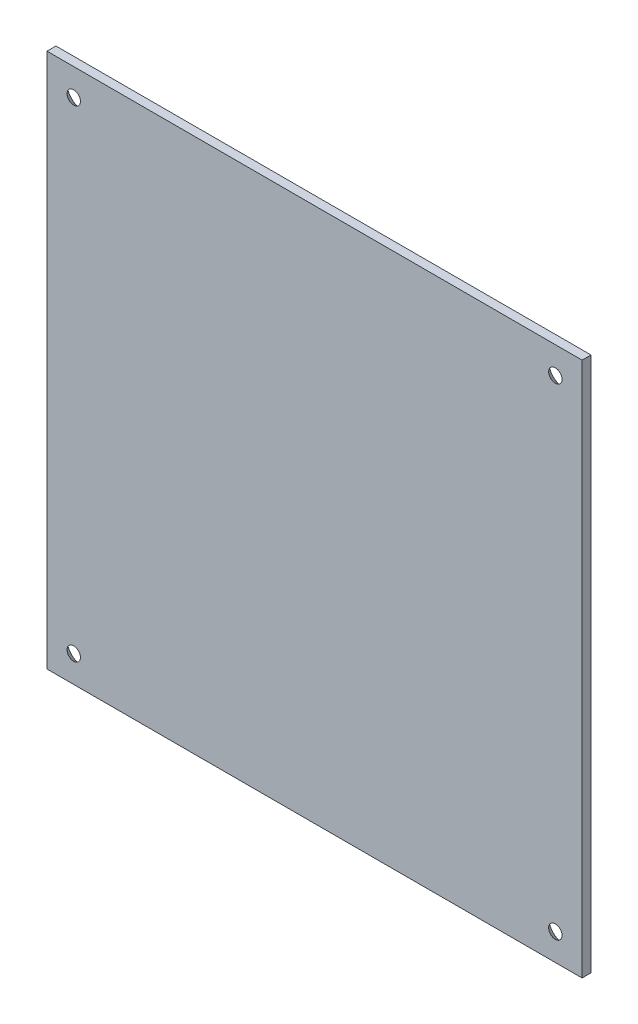
ISO-10303-21;
HEADER;
FILE_DESCRIPTION(('STEP AP214'),'2;1');
FILE_NAME('part.step','',(''),(''),'','','');
FILE_SCHEMA(('AUTOMOTIVE_DESIGN { 1 0 10303 214 1 1 1 1 }'));
ENDSEC;
DATA;
#1=APPLICATION_CONTEXT('core data for automotive mechanical design processes');
#2=APPLICATION_PROTOCOL_DEFINITION('international standard','automotive_design',2000,#1);
#3=PRODUCT_CONTEXT('',#1,'mechanical');
#4=PRODUCT('Part','Part','',(#3));
#5=PRODUCT_RELATED_PRODUCT_CATEGORY('part','',(#4));
#6=PRODUCT_DEFINITION_FORMATION('','',#4);
#7=PRODUCT_DEFINITION_CONTEXT('part definition',#1,'design');
#8=PRODUCT_DEFINITION('design','',#6,#7);
#9=PRODUCT_DEFINITION_SHAPE('','',#8);
#10=(LENGTH_UNIT() NAMED_UNIT(*) SI_UNIT(.MILLI.,.METRE.));
#11=(NAMED_UNIT(*) PLANE_ANGLE_UNIT() SI_UNIT($,.RADIAN.));
#12=(NAMED_UNIT(*) SI_UNIT($,.STERADIAN.) SOLID_ANGLE_UNIT());
#13=UNCERTAINTY_MEASURE_WITH_UNIT(LENGTH_MEASURE(1.E-05),#10,'distance_accuracy_value','');
#14=(GEOMETRIC_REPRESENTATION_CONTEXT(3) GLOBAL_UNCERTAINTY_ASSIGNED_CONTEXT((#13)) GLOBAL_UNIT_ASSIGNED_CONTEXT((#10,
#11,#12)) REPRESENTATION_CONTEXT('',''));
#15=CARTESIAN_POINT('',(0.,0.,0.));
#16=DIRECTION('',(0.,0.,1.));
#17=DIRECTION('',(1.,0.,0.));
#18=AXIS2_PLACEMENT_3D('',#15,#16,#17);
#19=CARTESIAN_POINT('',(-25.6040933899333,14.6908732565191,2.));
#20=DIRECTION('',(1.,0.,0.));
#21=DIRECTION('',(0.,1.,0.));
#22=AXIS2_PLACEMENT_3D('',#19,#20,#21);
#23=PLANE('',#22);
#24=DIRECTION('',(0.,-1.,0.));
#25=VECTOR('',#24,1.);
#26=CARTESIAN_POINT('',(-25.6040933899333,14.6908732565191,0.));
#27=LINE('',#26,#25);
#28=CARTESIAN_POINT('',(-25.6040933899333,14.6908732565191,0.));
#29=VERTEX_POINT('',#28);
#30=CARTESIAN_POINT('',(-25.6040933899333,-105.309126743481,0.));
#31=VERTEX_POINT('',#30);
#32=EDGE_CURVE('E103',#29,#31,#27,.T.);
#33=ORIENTED_EDGE('',*,*,#32,.T.);
#34=DIRECTION('',(0.,0.,-1.));
#35=VECTOR('',#34,1.);
#36=CARTESIAN_POINT('',(-25.6040933899333,-105.309126743481,2.));
#37=LINE('',#36,#35);
#38=CARTESIAN_POINT('',(-25.6040933899333,-105.309126743481,2.));
#39=VERTEX_POINT('',#38);
#40=EDGE_CURVE('E94',#39,#31,#37,.T.);
#41=ORIENTED_EDGE('',*,*,#40,.F.);
#42=DIRECTION('',(0.,-1.,0.));
#43=VECTOR('',#42,1.);
#44=CARTESIAN_POINT('',(-25.6040933899333,14.6908732565191,2.));
#45=LINE('',#44,#43);
#46=CARTESIAN_POINT('',(-25.6040933899333,14.6908732565191,2.));
#47=VERTEX_POINT('',#46);
#48=EDGE_CURVE('E88',#47,#39,#45,.T.);
#49=ORIENTED_EDGE('',*,*,#48,.F.);
#50=DIRECTION('',(0.,0.,-1.));
#51=VECTOR('',#50,1.);
#52=CARTESIAN_POINT('',(-25.6040933899333,14.6908732565191,2.));
#53=LINE('',#52,#51);
#54=EDGE_CURVE('E99',#47,#29,#53,.T.);
#55=ORIENTED_EDGE('',*,*,#54,.T.);
#56=EDGE_LOOP('',(#33,#41,#49,#55));
#57=FACE_BOUND('',#56,.T.);
#58=ADVANCED_FACE('F35',(#57),#23,.F.);
#59=CARTESIAN_POINT('',(-25.6040933899333,-105.309126743481,2.));
#60=DIRECTION('',(0.,1.,0.));
#61=DIRECTION('',(0.,0.,1.));
#62=AXIS2_PLACEMENT_3D('',#59,#60,#61);
#63=PLANE('',#62);
#64=DIRECTION('',(1.,0.,0.));
#65=VECTOR('',#64,1.);
#66=CARTESIAN_POINT('',(-25.6040933899333,-105.309126743481,0.));
#67=LINE('',#66,#65);
#68=CARTESIAN_POINT('',(94.3959066100667,-105.309126743481,0.));
#69=VERTEX_POINT('',#68);
#70=EDGE_CURVE('E93',#31,#69,#67,.T.);
#71=ORIENTED_EDGE('',*,*,#70,.T.);
#72=DIRECTION('',(0.,0.,-1.));
#73=VECTOR('',#72,1.);
#74=CARTESIAN_POINT('',(94.3959066100667,-105.309126743481,2.));
#75=LINE('',#74,#73);
#76=CARTESIAN_POINT('',(94.3959066100667,-105.309126743481,2.));
#77=VERTEX_POINT('',#76);
#78=EDGE_CURVE('E91',#77,#69,#75,.T.);
#79=ORIENTED_EDGE('',*,*,#78,.F.);
#80=DIRECTION('',(1.,0.,0.));
#81=VECTOR('',#80,1.);
#82=CARTESIAN_POINT('',(-25.6040933899333,-105.309126743481,2.));
#83=LINE('',#82,#81);
#84=EDGE_CURVE('E83',#39,#77,#83,.T.);
#85=ORIENTED_EDGE('',*,*,#84,.F.);
#86=ORIENTED_EDGE('',*,*,#40,.T.);
#87=EDGE_LOOP('',(#71,#79,#85,#86));
#88=FACE_BOUND('',#87,.T.);
#89=ADVANCED_FACE('F92',(#88),#63,.F.);
#90=CARTESIAN_POINT('',(94.3959066100667,14.6908732565191,2.));
#91=DIRECTION('',(-1.,0.,0.));
#92=DIRECTION('',(0.,0.,1.));
#93=AXIS2_PLACEMENT_3D('',#90,#91,#92);
#94=PLANE('',#93);
#95=DIRECTION('',(0.,1.,0.));
#96=VECTOR('',#95,1.);
#97=CARTESIAN_POINT('',(94.3959066100667,14.6908732565191,0.));
#98=LINE('',#97,#96);
#99=CARTESIAN_POINT('',(94.3959066100667,14.6908732565191,0.));
#100=VERTEX_POINT('',#99);
#101=EDGE_CURVE('E69',#69,#100,#98,.T.);
#102=ORIENTED_EDGE('',*,*,#101,.T.);
#103=DIRECTION('',(0.,0.,-1.));
#104=VECTOR('',#103,1.);
#105=CARTESIAN_POINT('',(94.3959066100667,14.6908732565191,2.));
#106=LINE('',#105,#104);
#107=CARTESIAN_POINT('',(94.3959066100667,14.6908732565191,2.));
#108=VERTEX_POINT('',#107);
#109=EDGE_CURVE('E95',#108,#100,#106,.T.);
#110=ORIENTED_EDGE('',*,*,#109,.F.);
#111=DIRECTION('',(0.,1.,0.));
#112=VECTOR('',#111,1.);
#113=CARTESIAN_POINT('',(94.3959066100667,14.6908732565191,2.));
#114=LINE('',#113,#112);
#115=EDGE_CURVE('E86',#77,#108,#114,.T.);
#116=ORIENTED_EDGE('',*,*,#115,.F.);
#117=ORIENTED_EDGE('',*,*,#78,.T.);
#118=EDGE_LOOP('',(#102,#110,#116,#117));
#119=FACE_BOUND('',#118,.T.);
#120=ADVANCED_FACE('F97',(#119),#94,.F.);
#121=CARTESIAN_POINT('',(-25.6040933899333,14.6908732565191,2.));
#122=DIRECTION('',(0.,-1.,0.));
#123=DIRECTION('',(0.,0.,-1.));
#124=AXIS2_PLACEMENT_3D('',#121,#122,#123);
#125=PLANE('',#124);
#126=DIRECTION('',(-1.,0.,0.));
#127=VECTOR('',#126,1.);
#128=CARTESIAN_POINT('',(-25.6040933899333,14.6908732565191,0.));
#129=LINE('',#128,#127);
#130=EDGE_CURVE('E75',#100,#29,#129,.T.);
#131=ORIENTED_EDGE('',*,*,#130,.T.);
#132=ORIENTED_EDGE('',*,*,#54,.F.);
#133=DIRECTION('',(-1.,0.,0.));
#134=VECTOR('',#133,1.);
#135=CARTESIAN_POINT('',(-25.6040933899333,14.6908732565191,2.));
#136=LINE('',#135,#134);
#137=EDGE_CURVE('E52',#108,#47,#136,.T.);
#138=ORIENTED_EDGE('',*,*,#137,.F.);
#139=ORIENTED_EDGE('',*,*,#109,.T.);
#140=EDGE_LOOP('',(#131,#132,#138,#139));
#141=FACE_BOUND('',#140,.T.);
#142=ADVANCED_FACE('F148',(#141),#125,.F.);
#143=CARTESIAN_POINT('',(0.,0.,2.));
#144=DIRECTION('',(0.,0.,1.));
#145=DIRECTION('',(1.,0.,0.));
#146=AXIS2_PLACEMENT_3D('',#143,#144,#145);
#147=PLANE('',#146);
#148=CARTESIAN_POINT('',(88.3959066100667,8.69087325651913,2.));
#149=DIRECTION('',(0.,0.,1.));
#150=DIRECTION('',(1.,0.,0.));
#151=AXIS2_PLACEMENT_3D('',#148,#149,#150);
#152=CIRCLE('',#151,1.5);
#153=CARTESIAN_POINT('',(89.8959066100667,8.69087325651913,2.));
#154=VERTEX_POINT('',#153);
#155=EDGE_CURVE('E141',#154,#154,#152,.T.);
#156=ORIENTED_EDGE('',*,*,#155,.F.);
#157=EDGE_LOOP('',(#156));
#158=FACE_BOUND('',#157,.T.);
#159=CARTESIAN_POINT('',(-19.6040933899332,8.69087325651877,2.));
#160=DIRECTION('',(0.,0.,1.));
#161=DIRECTION('',(1.,0.,0.));
#162=AXIS2_PLACEMENT_3D('',#159,#160,#161);
#163=CIRCLE('',#162,1.5);
#164=CARTESIAN_POINT('',(-18.1040933899332,8.69087325651877,2.));
#165=VERTEX_POINT('',#164);
#166=EDGE_CURVE('E136',#165,#165,#163,.T.);
#167=ORIENTED_EDGE('',*,*,#166,.F.);
#168=EDGE_LOOP('',(#167));
#169=FACE_BOUND('',#168,.T.);
#170=CARTESIAN_POINT('',(-19.6040933899333,-99.3091267434805,2.));
#171=DIRECTION('',(0.,0.,1.));
#172=DIRECTION('',(1.,0.,0.));
#173=AXIS2_PLACEMENT_3D('',#170,#171,#172);
#174=CIRCLE('',#173,1.5);
#175=CARTESIAN_POINT('',(-18.1040933899333,-99.3091267434805,2.));
#176=VERTEX_POINT('',#175);
#177=EDGE_CURVE('E133',#176,#176,#174,.T.);
#178=ORIENTED_EDGE('',*,*,#177,.F.);
#179=EDGE_LOOP('',(#178));
#180=FACE_BOUND('',#179,.T.);
#181=CARTESIAN_POINT('',(88.3959066100667,-99.3091267434809,2.));
#182=DIRECTION('',(0.,0.,1.));
#183=DIRECTION('',(1.,0.,0.));
#184=AXIS2_PLACEMENT_3D('',#181,#182,#183);
#185=CIRCLE('',#184,1.5);
#186=CARTESIAN_POINT('',(89.8959066100667,-99.3091267434809,2.));
#187=VERTEX_POINT('',#186);
#188=EDGE_CURVE('E106',#187,#187,#185,.T.);
#189=ORIENTED_EDGE('',*,*,#188,.F.);
#190=EDGE_LOOP('',(#189));
#191=FACE_BOUND('',#190,.T.);
#192=ORIENTED_EDGE('',*,*,#48,.T.);
#193=ORIENTED_EDGE('',*,*,#84,.T.);
#194=ORIENTED_EDGE('',*,*,#115,.T.);
#195=ORIENTED_EDGE('',*,*,#137,.T.);
#196=EDGE_LOOP('',(#192,#193,#194,#195));
#197=FACE_BOUND('',#196,.T.);
#198=ADVANCED_FACE('F84',(#158,#169,#180,#191,#197),#147,.T.);
#199=CARTESIAN_POINT('',(0.,0.,0.));
#200=DIRECTION('',(0.,0.,1.));
#201=DIRECTION('',(1.,0.,0.));
#202=AXIS2_PLACEMENT_3D('',#199,#200,#201);
#203=PLANE('',#202);
#204=CARTESIAN_POINT('',(-19.6040933899333,-99.3091267434805,0.));
#205=DIRECTION('',(0.,0.,1.));
#206=DIRECTION('',(1.,0.,0.));
#207=AXIS2_PLACEMENT_3D('',#204,#205,#206);
#208=CIRCLE('',#207,3.49999999999999);
#209=CARTESIAN_POINT('',(-16.1040933899333,-99.3091267434805,0.));
#210=VERTEX_POINT('',#209);
#211=EDGE_CURVE('E11',#210,#210,#208,.T.);
#212=ORIENTED_EDGE('',*,*,#211,.T.);
#213=EDGE_LOOP('',(#212));
#214=FACE_BOUND('',#213,.T.);
#215=CARTESIAN_POINT('',(88.3959066100667,-99.3091267434809,0.));
#216=DIRECTION('',(0.,0.,1.));
#217=DIRECTION('',(1.,0.,0.));
#218=AXIS2_PLACEMENT_3D('',#215,#216,#217);
#219=CIRCLE('',#218,3.49999999999999);
#220=CARTESIAN_POINT('',(91.8959066100667,-99.3091267434809,0.));
#221=VERTEX_POINT('',#220);
#222=EDGE_CURVE('E44',#221,#221,#219,.T.);
#223=ORIENTED_EDGE('',*,*,#222,.T.);
#224=EDGE_LOOP('',(#223));
#225=FACE_BOUND('',#224,.T.);
#226=CARTESIAN_POINT('',(88.3959066100667,8.69087325651913,0.));
#227=DIRECTION('',(0.,0.,1.));
#228=DIRECTION('',(1.,0.,0.));
#229=AXIS2_PLACEMENT_3D('',#226,#227,#228);
#230=CIRCLE('',#229,3.50000000000003);
#231=CARTESIAN_POINT('',(91.8959066100667,8.69087325651913,0.));
#232=VERTEX_POINT('',#231);
#233=EDGE_CURVE('E116',#232,#232,#230,.T.);
#234=ORIENTED_EDGE('',*,*,#233,.T.);
#235=EDGE_LOOP('',(#234));
#236=FACE_BOUND('',#235,.T.);
#237=CARTESIAN_POINT('',(-19.6040933899332,8.69087325651877,0.));
#238=DIRECTION('',(0.,0.,1.));
#239=DIRECTION('',(1.,0.,0.));
#240=AXIS2_PLACEMENT_3D('',#237,#238,#239);
#241=CIRCLE('',#240,3.49999999999999);
#242=CARTESIAN_POINT('',(-16.1040933899332,8.69087325651877,0.));
#243=VERTEX_POINT('',#242);
#244=EDGE_CURVE('E113',#243,#243,#241,.T.);
#245=ORIENTED_EDGE('',*,*,#244,.T.);
#246=EDGE_LOOP('',(#245));
#247=FACE_BOUND('',#246,.T.);
#248=ORIENTED_EDGE('',*,*,#32,.F.);
#249=ORIENTED_EDGE('',*,*,#130,.F.);
#250=ORIENTED_EDGE('',*,*,#101,.F.);
#251=ORIENTED_EDGE('',*,*,#70,.F.);
#252=EDGE_LOOP('',(#248,#249,#250,#251));
#253=FACE_BOUND('',#252,.T.);
#254=ADVANCED_FACE('F121',(#214,#225,#236,#247,#253),#203,.F.);
#255=CARTESIAN_POINT('',(-19.6040933899333,-99.3091267434805,2.));
#256=DIRECTION('',(0.,0.,-1.));
#257=DIRECTION('',(-1.,0.,0.));
#258=AXIS2_PLACEMENT_3D('',#255,#256,#257);
#259=CONICAL_SURFACE('',#258,1.5,0.785398163397447);
#260=ORIENTED_EDGE('',*,*,#211,.F.);
#261=EDGE_LOOP('',(#260));
#262=FACE_BOUND('',#261,.T.);
#263=ORIENTED_EDGE('',*,*,#177,.T.);
#264=EDGE_LOOP('',(#263));
#265=FACE_BOUND('',#264,.T.);
#266=ADVANCED_FACE('F128',(#262,#265),#259,.F.);
#267=CARTESIAN_POINT('',(88.3959066100667,-99.3091267434809,2.));
#268=DIRECTION('',(0.,0.,-1.));
#269=DIRECTION('',(-1.,0.,0.));
#270=AXIS2_PLACEMENT_3D('',#267,#268,#269);
#271=CONICAL_SURFACE('',#270,1.5,0.785398163397447);
#272=ORIENTED_EDGE('',*,*,#222,.F.);
#273=EDGE_LOOP('',(#272));
#274=FACE_BOUND('',#273,.T.);
#275=ORIENTED_EDGE('',*,*,#188,.T.);
#276=EDGE_LOOP('',(#275));
#277=FACE_BOUND('',#276,.T.);
#278=ADVANCED_FACE('F124',(#274,#277),#271,.F.);
#279=CARTESIAN_POINT('',(88.3959066100667,8.69087325651913,2.00000000000004));
#280=DIRECTION('',(0.,0.,-1.));
#281=DIRECTION('',(-1.,0.,0.));
#282=AXIS2_PLACEMENT_3D('',#279,#280,#281);
#283=CONICAL_SURFACE('',#282,1.5,0.785398163397447);
#284=ORIENTED_EDGE('',*,*,#233,.F.);
#285=EDGE_LOOP('',(#284));
#286=FACE_BOUND('',#285,.T.);
#287=ORIENTED_EDGE('',*,*,#155,.T.);
#288=EDGE_LOOP('',(#287));
#289=FACE_BOUND('',#288,.T.);
#290=ADVANCED_FACE('F127',(#286,#289),#283,.F.);
#291=CARTESIAN_POINT('',(-19.6040933899332,8.69087325651877,2.));
#292=DIRECTION('',(0.,0.,-1.));
#293=DIRECTION('',(-1.,0.,0.));
#294=AXIS2_PLACEMENT_3D('',#291,#292,#293);
#295=CONICAL_SURFACE('',#294,1.5,0.785398163397447);
#296=ORIENTED_EDGE('',*,*,#244,.F.);
#297=EDGE_LOOP('',(#296));
#298=FACE_BOUND('',#297,.T.);
#299=ORIENTED_EDGE('',*,*,#166,.T.);
#300=EDGE_LOOP('',(#299));
#301=FACE_BOUND('',#300,.T.);
#302=ADVANCED_FACE('F37',(#298,#301),#295,.F.);
#303=CLOSED_SHELL('',(#58,#89,#120,#142,#198,#254,#266,#278,#290,#302));
#304=MANIFOLD_SOLID_BREP('B2',#303);
#305=ADVANCED_BREP_SHAPE_REPRESENTATION('',(#18,#304),#14);
#306=SHAPE_DEFINITION_REPRESENTATION(#9,#305);
ENDSEC;
END-ISO-10303-21;
